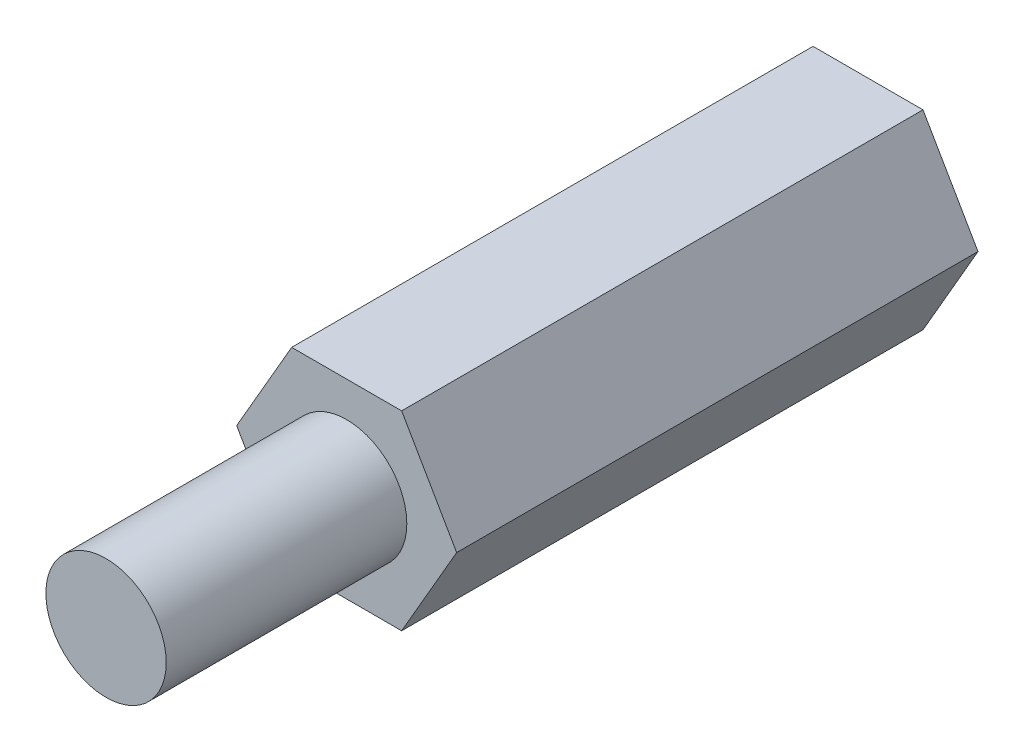
ISO-10303-21;
HEADER;
FILE_DESCRIPTION(('STEP AP214'),'2;1');
FILE_NAME('part.step','',(''),(''),'','','');
FILE_SCHEMA(('AUTOMOTIVE_DESIGN { 1 0 10303 214 1 1 1 1 }'));
ENDSEC;
DATA;
#1=APPLICATION_CONTEXT('core data for automotive mechanical design processes');
#2=APPLICATION_PROTOCOL_DEFINITION('international standard','automotive_design',2000,#1);
#3=PRODUCT_CONTEXT('',#1,'mechanical');
#4=PRODUCT('Part','Part','',(#3));
#5=PRODUCT_RELATED_PRODUCT_CATEGORY('part','',(#4));
#6=PRODUCT_DEFINITION_FORMATION('','',#4);
#7=PRODUCT_DEFINITION_CONTEXT('part definition',#1,'design');
#8=PRODUCT_DEFINITION('design','',#6,#7);
#9=PRODUCT_DEFINITION_SHAPE('','',#8);
#10=(LENGTH_UNIT() NAMED_UNIT(*) SI_UNIT(.MILLI.,.METRE.));
#11=(NAMED_UNIT(*) PLANE_ANGLE_UNIT() SI_UNIT($,.RADIAN.));
#12=(NAMED_UNIT(*) SI_UNIT($,.STERADIAN.) SOLID_ANGLE_UNIT());
#13=UNCERTAINTY_MEASURE_WITH_UNIT(LENGTH_MEASURE(1.E-05),#10,'distance_accuracy_value','');
#14=(GEOMETRIC_REPRESENTATION_CONTEXT(3) GLOBAL_UNCERTAINTY_ASSIGNED_CONTEXT((#13)) GLOBAL_UNIT_ASSIGNED_CONTEXT((#10,
#11,#12)) REPRESENTATION_CONTEXT('',''));
#15=CARTESIAN_POINT('',(0.,0.,0.));
#16=DIRECTION('',(0.,0.,1.));
#17=DIRECTION('',(1.,0.,0.));
#18=AXIS2_PLACEMENT_3D('',#15,#16,#17);
#19=CARTESIAN_POINT('',(1.37120688932539,-2.37499999999999,13.));
#20=DIRECTION('',(-0.866025403784442,0.499999999999995,0.));
#21=DIRECTION('',(-0.499999999999995,-0.866025403784442,0.));
#22=AXIS2_PLACEMENT_3D('',#19,#20,#21);
#23=PLANE('',#22);
#24=DIRECTION('',(0.499999999999995,0.866025403784442,0.));
#25=VECTOR('',#24,1.);
#26=CARTESIAN_POINT('',(1.37120688932539,-2.37499999999999,0.));
#27=LINE('',#26,#25);
#28=CARTESIAN_POINT('',(1.37120688932539,-2.37499999999999,0.));
#29=VERTEX_POINT('',#28);
#30=CARTESIAN_POINT('',(2.74241377865072,0.,0.));
#31=VERTEX_POINT('',#30);
#32=EDGE_CURVE('E132',#29,#31,#27,.T.);
#33=ORIENTED_EDGE('',*,*,#32,.T.);
#34=DIRECTION('',(0.,0.,-1.));
#35=VECTOR('',#34,1.);
#36=CARTESIAN_POINT('',(2.74241377865072,0.,13.));
#37=LINE('',#36,#35);
#38=CARTESIAN_POINT('',(2.74241377865072,0.,13.));
#39=VERTEX_POINT('',#38);
#40=EDGE_CURVE('E44',#39,#31,#37,.T.);
#41=ORIENTED_EDGE('',*,*,#40,.F.);
#42=DIRECTION('',(0.499999999999995,0.866025403784442,0.));
#43=VECTOR('',#42,1.);
#44=CARTESIAN_POINT('',(1.37120688932539,-2.37499999999999,13.));
#45=LINE('',#44,#43);
#46=CARTESIAN_POINT('',(1.37120688932539,-2.37499999999999,13.));
#47=VERTEX_POINT('',#46);
#48=EDGE_CURVE('E149',#47,#39,#45,.T.);
#49=ORIENTED_EDGE('',*,*,#48,.F.);
#50=DIRECTION('',(0.,0.,-1.));
#51=VECTOR('',#50,1.);
#52=CARTESIAN_POINT('',(1.37120688932539,-2.37499999999999,13.));
#53=LINE('',#52,#51);
#54=EDGE_CURVE('E128',#47,#29,#53,.T.);
#55=ORIENTED_EDGE('',*,*,#54,.T.);
#56=EDGE_LOOP('',(#33,#41,#49,#55));
#57=FACE_BOUND('',#56,.T.);
#58=ADVANCED_FACE('F41',(#57),#23,.F.);
#59=CARTESIAN_POINT('',(2.74241377865072,0.,13.));
#60=DIRECTION('',(-0.866025403784438,-0.500000000000001,0.));
#61=DIRECTION('',(0.500000000000001,-0.866025403784438,0.));
#62=AXIS2_PLACEMENT_3D('',#59,#60,#61);
#63=PLANE('',#62);
#64=DIRECTION('',(-0.500000000000001,0.866025403784438,0.));
#65=VECTOR('',#64,1.);
#66=CARTESIAN_POINT('',(2.74241377865072,0.,0.));
#67=LINE('',#66,#65);
#68=CARTESIAN_POINT('',(1.37120688932536,2.37500000000001,0.));
#69=VERTEX_POINT('',#68);
#70=EDGE_CURVE('E136',#31,#69,#67,.T.);
#71=ORIENTED_EDGE('',*,*,#70,.T.);
#72=DIRECTION('',(0.,0.,-1.));
#73=VECTOR('',#72,1.);
#74=CARTESIAN_POINT('',(1.37120688932536,2.37500000000001,13.));
#75=LINE('',#74,#73);
#76=CARTESIAN_POINT('',(1.37120688932536,2.37500000000001,13.));
#77=VERTEX_POINT('',#76);
#78=EDGE_CURVE('E155',#77,#69,#75,.T.);
#79=ORIENTED_EDGE('',*,*,#78,.F.);
#80=DIRECTION('',(-0.500000000000001,0.866025403784438,0.));
#81=VECTOR('',#80,1.);
#82=CARTESIAN_POINT('',(2.74241377865072,0.,13.));
#83=LINE('',#82,#81);
#84=EDGE_CURVE('E97',#39,#77,#83,.T.);
#85=ORIENTED_EDGE('',*,*,#84,.F.);
#86=ORIENTED_EDGE('',*,*,#40,.T.);
#87=EDGE_LOOP('',(#71,#79,#85,#86));
#88=FACE_BOUND('',#87,.T.);
#89=ADVANCED_FACE('F162',(#88),#63,.F.);
#90=CARTESIAN_POINT('',(1.37120688932536,2.37500000000001,13.));
#91=DIRECTION('',(0.,-1.,0.));
#92=DIRECTION('',(1.,0.,0.));
#93=AXIS2_PLACEMENT_3D('',#90,#91,#92);
#94=PLANE('',#93);
#95=DIRECTION('',(-1.,0.,0.));
#96=VECTOR('',#95,1.);
#97=CARTESIAN_POINT('',(1.37120688932536,2.37500000000001,0.));
#98=LINE('',#97,#96);
#99=CARTESIAN_POINT('',(-1.37120688932537,2.375,0.));
#100=VERTEX_POINT('',#99);
#101=EDGE_CURVE('E140',#69,#100,#98,.T.);
#102=ORIENTED_EDGE('',*,*,#101,.T.);
#103=DIRECTION('',(0.,0.,-1.));
#104=VECTOR('',#103,1.);
#105=CARTESIAN_POINT('',(-1.37120688932537,2.375,13.));
#106=LINE('',#105,#104);
#107=CARTESIAN_POINT('',(-1.37120688932537,2.375,13.));
#108=VERTEX_POINT('',#107);
#109=EDGE_CURVE('E121',#108,#100,#106,.T.);
#110=ORIENTED_EDGE('',*,*,#109,.F.);
#111=DIRECTION('',(-1.,0.,0.));
#112=VECTOR('',#111,1.);
#113=CARTESIAN_POINT('',(1.37120688932536,2.37500000000001,13.));
#114=LINE('',#113,#112);
#115=EDGE_CURVE('E110',#77,#108,#114,.T.);
#116=ORIENTED_EDGE('',*,*,#115,.F.);
#117=ORIENTED_EDGE('',*,*,#78,.T.);
#118=EDGE_LOOP('',(#102,#110,#116,#117));
#119=FACE_BOUND('',#118,.T.);
#120=ADVANCED_FACE('F168',(#119),#94,.F.);
#121=CARTESIAN_POINT('',(-1.37120688932537,2.375,13.));
#122=DIRECTION('',(0.866025403784442,-0.499999999999995,0.));
#123=DIRECTION('',(0.499999999999995,0.866025403784442,0.));
#124=AXIS2_PLACEMENT_3D('',#121,#122,#123);
#125=PLANE('',#124);
#126=DIRECTION('',(-0.499999999999995,-0.866025403784442,0.));
#127=VECTOR('',#126,1.);
#128=CARTESIAN_POINT('',(-1.37120688932537,2.375,0.));
#129=LINE('',#128,#127);
#130=CARTESIAN_POINT('',(-2.74241377865072,0.,0.));
#131=VERTEX_POINT('',#130);
#132=EDGE_CURVE('E119',#100,#131,#129,.T.);
#133=ORIENTED_EDGE('',*,*,#132,.T.);
#134=DIRECTION('',(0.,0.,-1.));
#135=VECTOR('',#134,1.);
#136=CARTESIAN_POINT('',(-2.74241377865072,0.,13.));
#137=LINE('',#136,#135);
#138=CARTESIAN_POINT('',(-2.74241377865072,0.,13.));
#139=VERTEX_POINT('',#138);
#140=EDGE_CURVE('E116',#139,#131,#137,.T.);
#141=ORIENTED_EDGE('',*,*,#140,.F.);
#142=DIRECTION('',(-0.499999999999995,-0.866025403784442,0.));
#143=VECTOR('',#142,1.);
#144=CARTESIAN_POINT('',(-1.37120688932537,2.375,13.));
#145=LINE('',#144,#143);
#146=EDGE_CURVE('E104',#108,#139,#145,.T.);
#147=ORIENTED_EDGE('',*,*,#146,.F.);
#148=ORIENTED_EDGE('',*,*,#109,.T.);
#149=EDGE_LOOP('',(#133,#141,#147,#148));
#150=FACE_BOUND('',#149,.T.);
#151=ADVANCED_FACE('F117',(#150),#125,.F.);
#152=CARTESIAN_POINT('',(-2.74241377865072,0.,13.));
#153=DIRECTION('',(0.866025403784435,0.500000000000007,0.));
#154=DIRECTION('',(-0.500000000000007,0.866025403784435,0.));
#155=AXIS2_PLACEMENT_3D('',#152,#153,#154);
#156=PLANE('',#155);
#157=DIRECTION('',(0.500000000000007,-0.866025403784435,0.));
#158=VECTOR('',#157,1.);
#159=CARTESIAN_POINT('',(-2.74241377865072,0.,0.));
#160=LINE('',#159,#158);
#161=CARTESIAN_POINT('',(-1.37120688932534,-2.37500000000001,0.));
#162=VERTEX_POINT('',#161);
#163=EDGE_CURVE('E82',#131,#162,#160,.T.);
#164=ORIENTED_EDGE('',*,*,#163,.T.);
#165=DIRECTION('',(0.,0.,-1.));
#166=VECTOR('',#165,1.);
#167=CARTESIAN_POINT('',(-1.37120688932534,-2.37500000000001,13.));
#168=LINE('',#167,#166);
#169=CARTESIAN_POINT('',(-1.37120688932534,-2.37500000000001,13.));
#170=VERTEX_POINT('',#169);
#171=EDGE_CURVE('E122',#170,#162,#168,.T.);
#172=ORIENTED_EDGE('',*,*,#171,.F.);
#173=DIRECTION('',(0.500000000000007,-0.866025403784435,0.));
#174=VECTOR('',#173,1.);
#175=CARTESIAN_POINT('',(-2.74241377865072,0.,13.));
#176=LINE('',#175,#174);
#177=EDGE_CURVE('E108',#139,#170,#176,.T.);
#178=ORIENTED_EDGE('',*,*,#177,.F.);
#179=ORIENTED_EDGE('',*,*,#140,.T.);
#180=EDGE_LOOP('',(#164,#172,#178,#179));
#181=FACE_BOUND('',#180,.T.);
#182=ADVANCED_FACE('F124',(#181),#156,.F.);
#183=CARTESIAN_POINT('',(-1.37120688932534,-2.37500000000001,13.));
#184=DIRECTION('',(0.,1.,0.));
#185=DIRECTION('',(-1.,0.,0.));
#186=AXIS2_PLACEMENT_3D('',#183,#184,#185);
#187=PLANE('',#186);
#188=DIRECTION('',(1.,0.,0.));
#189=VECTOR('',#188,1.);
#190=CARTESIAN_POINT('',(-1.37120688932534,-2.37500000000001,0.));
#191=LINE('',#190,#189);
#192=EDGE_CURVE('E88',#162,#29,#191,.T.);
#193=ORIENTED_EDGE('',*,*,#192,.T.);
#194=ORIENTED_EDGE('',*,*,#54,.F.);
#195=DIRECTION('',(1.,0.,0.));
#196=VECTOR('',#195,1.);
#197=CARTESIAN_POINT('',(-1.37120688932534,-2.37500000000001,13.));
#198=LINE('',#197,#196);
#199=EDGE_CURVE('E59',#170,#47,#198,.T.);
#200=ORIENTED_EDGE('',*,*,#199,.F.);
#201=ORIENTED_EDGE('',*,*,#171,.T.);
#202=EDGE_LOOP('',(#193,#194,#200,#201));
#203=FACE_BOUND('',#202,.T.);
#204=ADVANCED_FACE('F188',(#203),#187,.F.);
#205=CARTESIAN_POINT('',(0.,0.,13.));
#206=DIRECTION('',(0.,0.,1.));
#207=DIRECTION('',(1.,0.,0.));
#208=AXIS2_PLACEMENT_3D('',#205,#206,#207);
#209=PLANE('',#208);
#210=CARTESIAN_POINT('',(0.,0.,13.));
#211=DIRECTION('',(0.,0.,1.));
#212=DIRECTION('',(1.,0.,0.));
#213=AXIS2_PLACEMENT_3D('',#210,#211,#212);
#214=CIRCLE('',#213,1.5);
#215=CARTESIAN_POINT('',(1.5,0.,13.));
#216=VERTEX_POINT('',#215);
#217=EDGE_CURVE('E11',#216,#216,#214,.T.);
#218=ORIENTED_EDGE('',*,*,#217,.F.);
#219=EDGE_LOOP('',(#218));
#220=FACE_BOUND('',#219,.T.);
#221=ORIENTED_EDGE('',*,*,#48,.T.);
#222=ORIENTED_EDGE('',*,*,#84,.T.);
#223=ORIENTED_EDGE('',*,*,#115,.T.);
#224=ORIENTED_EDGE('',*,*,#146,.T.);
#225=ORIENTED_EDGE('',*,*,#177,.T.);
#226=ORIENTED_EDGE('',*,*,#199,.T.);
#227=EDGE_LOOP('',(#221,#222,#223,#224,#225,#226));
#228=FACE_BOUND('',#227,.T.);
#229=ADVANCED_FACE('F106',(#220,#228),#209,.T.);
#230=CARTESIAN_POINT('',(0.,0.,0.));
#231=DIRECTION('',(0.,0.,1.));
#232=DIRECTION('',(1.,0.,0.));
#233=AXIS2_PLACEMENT_3D('',#230,#231,#232);
#234=PLANE('',#233);
#235=ORIENTED_EDGE('',*,*,#32,.F.);
#236=ORIENTED_EDGE('',*,*,#192,.F.);
#237=ORIENTED_EDGE('',*,*,#163,.F.);
#238=ORIENTED_EDGE('',*,*,#132,.F.);
#239=ORIENTED_EDGE('',*,*,#101,.F.);
#240=ORIENTED_EDGE('',*,*,#70,.F.);
#241=EDGE_LOOP('',(#235,#236,#237,#238,#239,#240));
#242=FACE_BOUND('',#241,.T.);
#243=ADVANCED_FACE('F167',(#242),#234,.F.);
#244=CARTESIAN_POINT('',(0.,0.,19.));
#245=DIRECTION('',(0.,0.,-1.));
#246=DIRECTION('',(-1.,0.,0.));
#247=AXIS2_PLACEMENT_3D('',#244,#245,#246);
#248=CYLINDRICAL_SURFACE('',#247,1.5);
#249=CARTESIAN_POINT('',(0.,0.,19.));
#250=DIRECTION('',(0.,0.,1.));
#251=DIRECTION('',(1.,0.,0.));
#252=AXIS2_PLACEMENT_3D('',#249,#250,#251);
#253=CIRCLE('',#252,1.5);
#254=CARTESIAN_POINT('',(1.5,0.,19.));
#255=VERTEX_POINT('',#254);
#256=EDGE_CURVE('E137',#255,#255,#253,.T.);
#257=ORIENTED_EDGE('',*,*,#256,.F.);
#258=EDGE_LOOP('',(#257));
#259=FACE_BOUND('',#258,.T.);
#260=ORIENTED_EDGE('',*,*,#217,.T.);
#261=EDGE_LOOP('',(#260));
#262=FACE_BOUND('',#261,.T.);
#263=ADVANCED_FACE('F181',(#259,#262),#248,.T.);
#264=CARTESIAN_POINT('',(0.,0.,19.));
#265=DIRECTION('',(0.,0.,1.));
#266=DIRECTION('',(1.,0.,0.));
#267=AXIS2_PLACEMENT_3D('',#264,#265,#266);
#268=PLANE('',#267);
#269=ORIENTED_EDGE('',*,*,#256,.T.);
#270=EDGE_LOOP('',(#269));
#271=FACE_BOUND('',#270,.T.);
#272=ADVANCED_FACE('F179',(#271),#268,.T.);
#273=CLOSED_SHELL('',(#58,#89,#120,#151,#182,#204,#229,#243,#263,#272));
#274=MANIFOLD_SOLID_BREP('B2',#273);
#275=ADVANCED_BREP_SHAPE_REPRESENTATION('',(#18,#274),#14);
#276=SHAPE_DEFINITION_REPRESENTATION(#9,#275);
ENDSEC;
END-ISO-10303-21;
